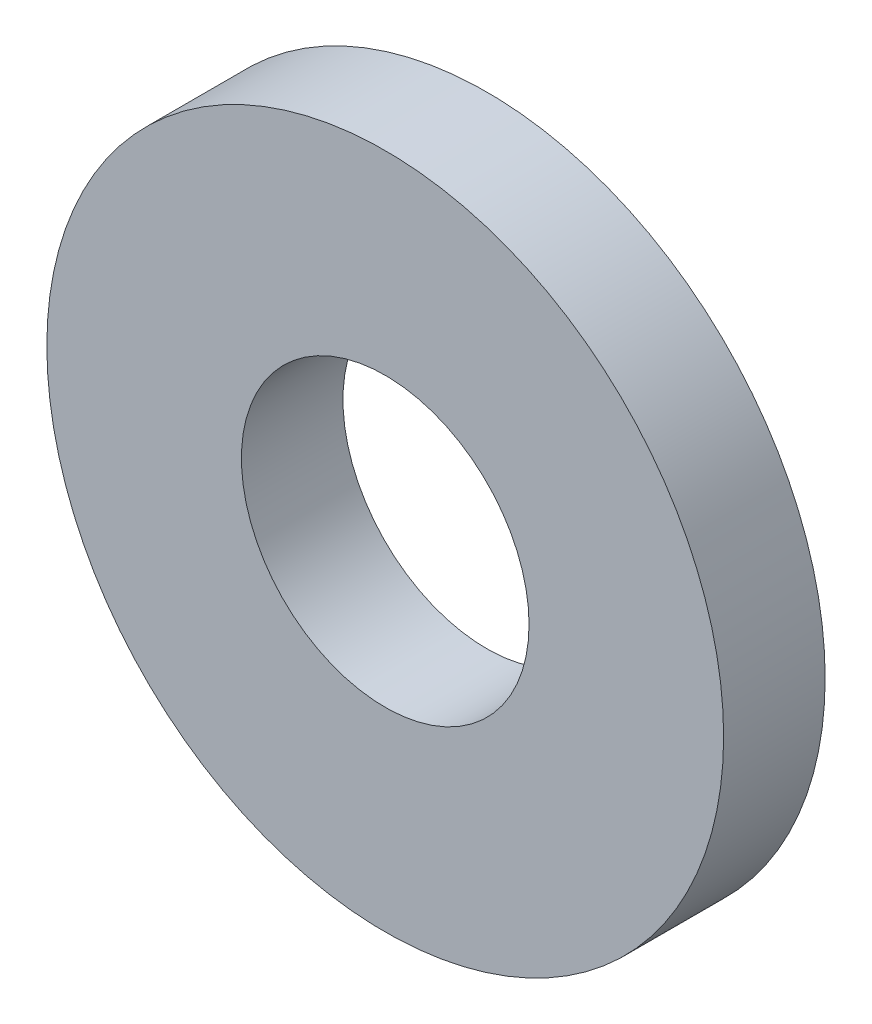
ISO-10303-21;
HEADER;
FILE_DESCRIPTION(('STEP AP214'),'2;1');
FILE_NAME('part.step','',(''),(''),'','','');
FILE_SCHEMA(('AUTOMOTIVE_DESIGN { 1 0 10303 214 1 1 1 1 }'));
ENDSEC;
DATA;
#1=APPLICATION_CONTEXT('core data for automotive mechanical design processes');
#2=APPLICATION_PROTOCOL_DEFINITION('international standard','automotive_design',2000,#1);
#3=PRODUCT_CONTEXT('',#1,'mechanical');
#4=PRODUCT('Part','Part','',(#3));
#5=PRODUCT_RELATED_PRODUCT_CATEGORY('part','',(#4));
#6=PRODUCT_DEFINITION_FORMATION('','',#4);
#7=PRODUCT_DEFINITION_CONTEXT('part definition',#1,'design');
#8=PRODUCT_DEFINITION('design','',#6,#7);
#9=PRODUCT_DEFINITION_SHAPE('','',#8);
#10=(LENGTH_UNIT() NAMED_UNIT(*) SI_UNIT(.MILLI.,.METRE.));
#11=(NAMED_UNIT(*) PLANE_ANGLE_UNIT() SI_UNIT($,.RADIAN.));
#12=(NAMED_UNIT(*) SI_UNIT($,.STERADIAN.) SOLID_ANGLE_UNIT());
#13=UNCERTAINTY_MEASURE_WITH_UNIT(LENGTH_MEASURE(1.E-05),#10,'distance_accuracy_value','');
#14=(GEOMETRIC_REPRESENTATION_CONTEXT(3) GLOBAL_UNCERTAINTY_ASSIGNED_CONTEXT((#13)) GLOBAL_UNIT_ASSIGNED_CONTEXT((#10,
#11,#12)) REPRESENTATION_CONTEXT('',''));
#15=CARTESIAN_POINT('',(0.,0.,0.));
#16=DIRECTION('',(0.,0.,1.));
#17=DIRECTION('',(1.,0.,0.));
#18=AXIS2_PLACEMENT_3D('',#15,#16,#17);
#19=CARTESIAN_POINT('',(0.,0.,3.));
#20=DIRECTION('',(0.,0.,1.));
#21=DIRECTION('',(1.,0.,0.));
#22=AXIS2_PLACEMENT_3D('',#19,#20,#21);
#23=PLANE('',#22);
#24=CARTESIAN_POINT('',(0.,0.,3.));
#25=DIRECTION('',(0.,0.,1.));
#26=DIRECTION('',(1.,0.,0.));
#27=AXIS2_PLACEMENT_3D('',#24,#25,#26);
#28=CIRCLE('',#27,10.);
#29=CARTESIAN_POINT('',(10.,0.,3.));
#30=VERTEX_POINT('',#29);
#31=EDGE_CURVE('E10',#30,#30,#28,.T.);
#32=ORIENTED_EDGE('',*,*,#31,.T.);
#33=EDGE_LOOP('',(#32));
#34=FACE_BOUND('',#33,.T.);
#35=CARTESIAN_POINT('',(0.,0.,3.));
#36=DIRECTION('',(0.,0.,1.));
#37=DIRECTION('',(1.,0.,0.));
#38=AXIS2_PLACEMENT_3D('',#35,#36,#37);
#39=CIRCLE('',#38,4.25);
#40=CARTESIAN_POINT('',(4.25,0.,3.));
#41=VERTEX_POINT('',#40);
#42=EDGE_CURVE('E41',#41,#41,#39,.T.);
#43=ORIENTED_EDGE('',*,*,#42,.F.);
#44=EDGE_LOOP('',(#43));
#45=FACE_BOUND('',#44,.T.);
#46=ADVANCED_FACE('F30',(#34,#45),#23,.T.);
#47=CARTESIAN_POINT('',(0.,0.,0.));
#48=DIRECTION('',(0.,0.,1.));
#49=DIRECTION('',(1.,0.,0.));
#50=AXIS2_PLACEMENT_3D('',#47,#48,#49);
#51=PLANE('',#50);
#52=CARTESIAN_POINT('',(0.,0.,0.));
#53=DIRECTION('',(0.,0.,1.));
#54=DIRECTION('',(1.,0.,0.));
#55=AXIS2_PLACEMENT_3D('',#52,#53,#54);
#56=CIRCLE('',#55,10.);
#57=CARTESIAN_POINT('',(10.,0.,0.));
#58=VERTEX_POINT('',#57);
#59=EDGE_CURVE('E34',#58,#58,#56,.T.);
#60=ORIENTED_EDGE('',*,*,#59,.F.);
#61=EDGE_LOOP('',(#60));
#62=FACE_BOUND('',#61,.T.);
#63=CARTESIAN_POINT('',(0.,0.,0.));
#64=DIRECTION('',(0.,0.,1.));
#65=DIRECTION('',(1.,0.,0.));
#66=AXIS2_PLACEMENT_3D('',#63,#64,#65);
#67=CIRCLE('',#66,4.25);
#68=CARTESIAN_POINT('',(4.25,0.,0.));
#69=VERTEX_POINT('',#68);
#70=EDGE_CURVE('E43',#69,#69,#67,.T.);
#71=ORIENTED_EDGE('',*,*,#70,.T.);
#72=EDGE_LOOP('',(#71));
#73=FACE_BOUND('',#72,.T.);
#74=ADVANCED_FACE('F53',(#62,#73),#51,.F.);
#75=CARTESIAN_POINT('',(0.,0.,3.));
#76=DIRECTION('',(0.,0.,-1.));
#77=DIRECTION('',(-1.,0.,0.));
#78=AXIS2_PLACEMENT_3D('',#75,#76,#77);
#79=CYLINDRICAL_SURFACE('',#78,10.);
#80=ORIENTED_EDGE('',*,*,#31,.F.);
#81=EDGE_LOOP('',(#80));
#82=FACE_BOUND('',#81,.T.);
#83=ORIENTED_EDGE('',*,*,#59,.T.);
#84=EDGE_LOOP('',(#83));
#85=FACE_BOUND('',#84,.T.);
#86=ADVANCED_FACE('F32',(#82,#85),#79,.T.);
#87=CARTESIAN_POINT('',(0.,0.,3.));
#88=DIRECTION('',(0.,0.,-1.));
#89=DIRECTION('',(-1.,0.,0.));
#90=AXIS2_PLACEMENT_3D('',#87,#88,#89);
#91=CYLINDRICAL_SURFACE('',#90,4.25);
#92=ORIENTED_EDGE('',*,*,#42,.T.);
#93=EDGE_LOOP('',(#92));
#94=FACE_BOUND('',#93,.T.);
#95=ORIENTED_EDGE('',*,*,#70,.F.);
#96=EDGE_LOOP('',(#95));
#97=FACE_BOUND('',#96,.T.);
#98=ADVANCED_FACE('F49',(#94,#97),#91,.F.);
#99=CLOSED_SHELL('',(#46,#74,#86,#98));
#100=MANIFOLD_SOLID_BREP('B2',#99);
#101=ADVANCED_BREP_SHAPE_REPRESENTATION('',(#18,#100),#14);
#102=SHAPE_DEFINITION_REPRESENTATION(#9,#101);
ENDSEC;
END-ISO-10303-21;
